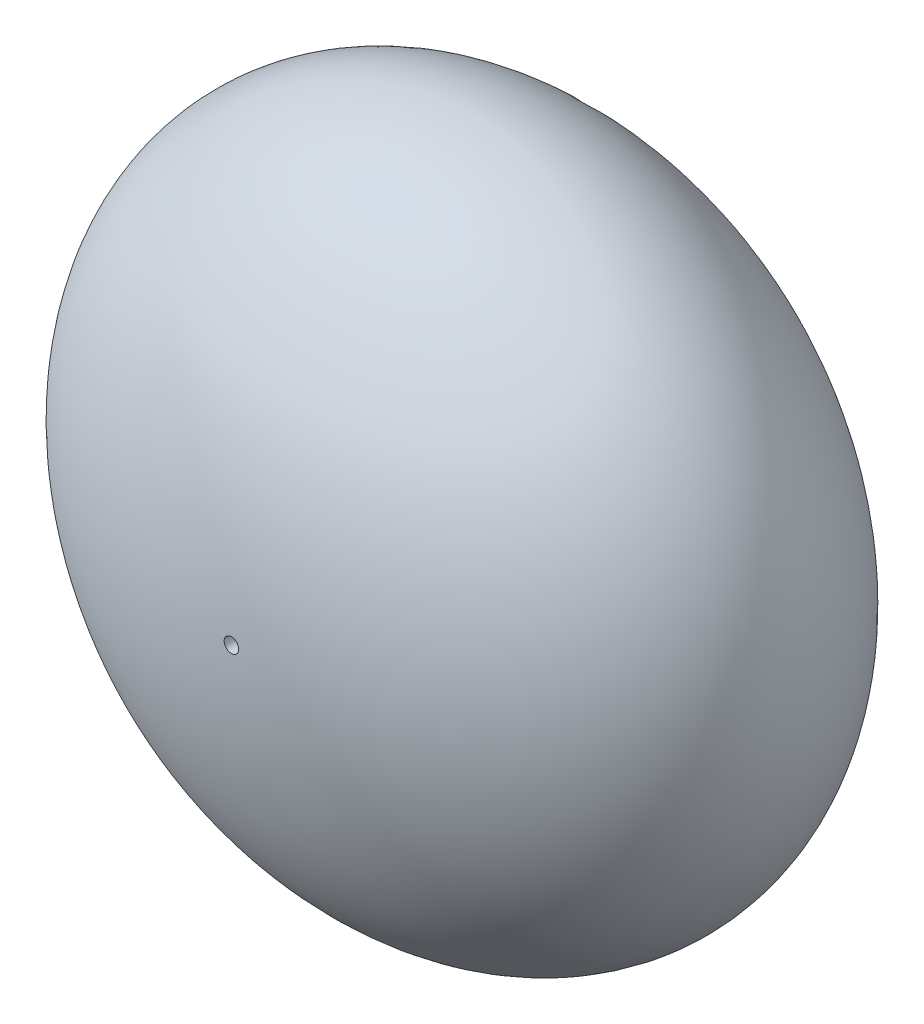
ISO-10303-21;
HEADER;
FILE_DESCRIPTION(('STEP AP214'),'2;1');
FILE_NAME('part.step','',(''),(''),'','','');
FILE_SCHEMA(('AUTOMOTIVE_DESIGN { 1 0 10303 214 1 1 1 1 }'));
ENDSEC;
DATA;
#1=APPLICATION_CONTEXT('core data for automotive mechanical design processes');
#2=APPLICATION_PROTOCOL_DEFINITION('international standard','automotive_design',2000,#1);
#3=PRODUCT_CONTEXT('',#1,'mechanical');
#4=PRODUCT('Part','Part','',(#3));
#5=PRODUCT_RELATED_PRODUCT_CATEGORY('part','',(#4));
#6=PRODUCT_DEFINITION_FORMATION('','',#4);
#7=PRODUCT_DEFINITION_CONTEXT('part definition',#1,'design');
#8=PRODUCT_DEFINITION('design','',#6,#7);
#9=PRODUCT_DEFINITION_SHAPE('','',#8);
#10=(LENGTH_UNIT() NAMED_UNIT(*) SI_UNIT(.MILLI.,.METRE.));
#11=(NAMED_UNIT(*) PLANE_ANGLE_UNIT() SI_UNIT($,.RADIAN.));
#12=(NAMED_UNIT(*) SI_UNIT($,.STERADIAN.) SOLID_ANGLE_UNIT());
#13=UNCERTAINTY_MEASURE_WITH_UNIT(LENGTH_MEASURE(1.E-05),#10,'distance_accuracy_value','');
#14=(GEOMETRIC_REPRESENTATION_CONTEXT(3) GLOBAL_UNCERTAINTY_ASSIGNED_CONTEXT((#13)) GLOBAL_UNIT_ASSIGNED_CONTEXT((#10,
#11,#12)) REPRESENTATION_CONTEXT('',''));
#15=CARTESIAN_POINT('',(0.,0.,0.));
#16=DIRECTION('',(0.,0.,1.));
#17=DIRECTION('',(1.,0.,0.));
#18=AXIS2_PLACEMENT_3D('',#15,#16,#17);
#19=CARTESIAN_POINT('',(0.,0.,-17.5));
#20=DIRECTION('',(0.,0.,1.));
#21=DIRECTION('',(1.,0.,0.));
#22=AXIS2_PLACEMENT_3D('',#19,#20,#21);
#23=CYLINDRICAL_SURFACE('',#22,0.55);
#24=CARTESIAN_POINT('',(0.55,0.,-11.177921898939));
#25=CARTESIAN_POINT('',(0.549996584354101,0.0292890880464978,-11.1779252434519));
#26=CARTESIAN_POINT('',(0.54764557992176,0.0586240745401949,-11.1790302905555));
#27=CARTESIAN_POINT('',(0.538333684049462,0.116444651901983,-11.1833094454078));
#28=CARTESIAN_POINT('',(0.531360454530933,0.14492775559188,-11.1864890905117));
#29=CARTESIAN_POINT('',(0.513127064567445,0.200102445264119,-11.1944867242729));
#30=CARTESIAN_POINT('',(0.501884747890616,0.226800951473643,-11.1992978847494));
#31=CARTESIAN_POINT('',(0.475484784760556,0.277925505448982,-11.2100067448396));
#32=CARTESIAN_POINT('',(0.460327980017856,0.302352040210257,-11.215904210793));
#33=CARTESIAN_POINT('',(0.425489163476123,0.349821819217232,-11.2285443996601));
#34=CARTESIAN_POINT('',(0.405595037885859,0.372701684993177,-11.2353163453649));
#35=CARTESIAN_POINT('',(0.362291415131879,0.414921572384582,-11.2487026551725));
#36=CARTESIAN_POINT('',(0.338880544397149,0.434260204286108,-11.2553169565278));
#37=CARTESIAN_POINT('',(0.287915869395404,0.469691154857652,-11.2679998070127));
#38=CARTESIAN_POINT('',(0.260223115099164,0.485598412218806,-11.2740304453197));
#39=CARTESIAN_POINT('',(0.202253279205904,0.512457490945118,-11.2845073376012));
#40=CARTESIAN_POINT('',(0.171977386097639,0.523411576779545,-11.2889543153887));
#41=CARTESIAN_POINT('',(0.111417228742464,0.53945739634447,-11.2955553658956));
#42=CARTESIAN_POINT('',(0.0812199224342666,0.544831200052888,-11.2978192983373));
#43=CARTESIAN_POINT('',(0.020273076524319,0.550476597756748,-11.3001990180682));
#44=CARTESIAN_POINT('',(-0.0104762263121764,0.550750329323415,-11.3003157053228));
#45=CARTESIAN_POINT('',(-0.0695984560905614,0.546332903137321,-11.2984516009316));
#46=CARTESIAN_POINT('',(-0.0979994824287844,0.541952017620544,-11.2966018835161));
#47=CARTESIAN_POINT('',(-0.153619039878556,0.5288832261357,-11.2911941129559));
#48=CARTESIAN_POINT('',(-0.180837483530745,0.520195002200835,-11.2876359336934));
#49=CARTESIAN_POINT('',(-0.233820832834373,0.498656645870309,-11.2790854512892));
#50=CARTESIAN_POINT('',(-0.259557148757144,0.48574490583588,-11.2740720511414));
#51=CARTESIAN_POINT('',(-0.308565411113046,0.456187553243323,-11.2630989635277));
#52=CARTESIAN_POINT('',(-0.331836474004553,0.439540608615719,-11.2571389386933));
#53=CARTESIAN_POINT('',(-0.377043406996226,0.401585748001151,-11.2443590174114));
#54=CARTESIAN_POINT('',(-0.398760832763222,0.380027735064598,-11.2375081071535));
#55=CARTESIAN_POINT('',(-0.438368395045668,0.333565045382268,-11.2240391008266));
#56=CARTESIAN_POINT('',(-0.456256961893147,0.308659002873907,-11.2174211011665));
#57=CARTESIAN_POINT('',(-0.488284619318832,0.255116036708731,-11.2049417129157));
#58=CARTESIAN_POINT('',(-0.502271701865277,0.226379495620266,-11.1991146355407));
#59=CARTESIAN_POINT('',(-0.525118260627799,0.166647052477239,-11.1892885685234));
#60=CARTESIAN_POINT('',(-0.533981535407572,0.1356528434023,-11.185288225085));
#61=CARTESIAN_POINT('',(-0.54576394234899,0.0744763045543522,-11.1799072944525));
#62=CARTESIAN_POINT('',(-0.549038154845649,0.0443763493187677,-11.1783706262727));
#63=CARTESIAN_POINT('',(-0.550595148433997,-0.0159756645445513,-11.1776443562661));
#64=CARTESIAN_POINT('',(-0.548879747504865,-0.0462276637650902,-11.1784538995904));
#65=CARTESIAN_POINT('',(-0.540830503798465,-0.103890538612671,-11.1821671773214));
#66=CARTESIAN_POINT('',(-0.534813347651109,-0.131356080444527,-11.1849271710595));
#67=CARTESIAN_POINT('',(-0.518754544627559,-0.184863299988254,-11.1920445782361));
#68=CARTESIAN_POINT('',(-0.508711937488001,-0.210904636273031,-11.1964023728056));
#69=CARTESIAN_POINT('',(-0.484409744819563,-0.262076090821648,-11.2064520888271));
#70=CARTESIAN_POINT('',(-0.469987481429532,-0.28711895464769,-11.2121932963035));
#71=CARTESIAN_POINT('',(-0.437495528973988,-0.334551847659952,-11.2242948702046));
#72=CARTESIAN_POINT('',(-0.419424227205111,-0.356940696928813,-11.2306555097434));
#73=CARTESIAN_POINT('',(-0.378349831041445,-0.400398299140258,-11.2439271761637));
#74=CARTESIAN_POINT('',(-0.355059163319483,-0.421195993712111,-11.2508393303521));
#75=CARTESIAN_POINT('',(-0.305160588170078,-0.458639149779856,-11.2639389659696));
#76=CARTESIAN_POINT('',(-0.278552391319555,-0.475284248620322,-11.270126384081));
#77=CARTESIAN_POINT('',(-0.22254516924064,-0.503950781420576,-11.2811284519294));
#78=CARTESIAN_POINT('',(-0.19313595227656,-0.515954458654376,-11.2859378118077));
#79=CARTESIAN_POINT('',(-0.132459111225027,-0.534753805535516,-11.2935946764136));
#80=CARTESIAN_POINT('',(-0.101192644114628,-0.541552681607886,-11.2964433888914));
#81=CARTESIAN_POINT('',(-0.0401076393742858,-0.549336586273179,-11.2997151702275));
#82=CARTESIAN_POINT('',(-0.0103459693448551,-0.550703430440474,-11.3002974773761));
#83=CARTESIAN_POINT('',(0.0489737753278211,-0.548618129779913,-11.2994155631013));
#84=CARTESIAN_POINT('',(0.0785318866334914,-0.545166876815352,-11.2979517204345));
#85=CARTESIAN_POINT('',(0.135463260804812,-0.53381748166551,-11.2932270000675));
#86=CARTESIAN_POINT('',(0.162876891838657,-0.526090561896401,-11.2900354119795));
#87=CARTESIAN_POINT('',(0.21600609040639,-0.506598978061614,-11.2822102384334));
#88=CARTESIAN_POINT('',(0.241721339583218,-0.494833559537302,-11.277576383551));
#89=CARTESIAN_POINT('',(0.292012861209467,-0.467002939755495,-11.2670511217473));
#90=CARTESIAN_POINT('',(0.31648423274669,-0.450766603879703,-11.2611121277958));
#91=CARTESIAN_POINT('',(0.362460491360178,-0.414700935735991,-11.2486755250582));
#92=CARTESIAN_POINT('',(0.383964231440921,-0.394870221045823,-11.2421777018496));
#93=CARTESIAN_POINT('',(0.424973349371498,-0.350531816418174,-11.2287780194831));
#94=CARTESIAN_POINT('',(0.444230913820389,-0.325792944680935,-11.2218799766774));
#95=CARTESIAN_POINT('',(0.478361492723613,-0.273225628506289,-11.20892714366));
#96=CARTESIAN_POINT('',(0.493232006013242,-0.245395434027496,-11.2028728355156));
#97=CARTESIAN_POINT('',(0.518032240823997,-0.187437828597399,-11.1924026431488));
#98=CARTESIAN_POINT('',(0.527979232708572,-0.157318881173992,-11.1879810458919));
#99=CARTESIAN_POINT('',(0.542539705327344,-0.0956420665439862,-11.1814047782879));
#100=CARTESIAN_POINT('',(0.547171075393702,-0.064089399399714,-11.179242506563));
#101=CARTESIAN_POINT('',(0.549682841821689,-0.0216100774158191,-11.1780694531136));
#102=CARTESIAN_POINT('',(0.550001260430514,-0.0108081637806635,-11.1779206647577));
#103=CARTESIAN_POINT('',(0.55,0.,-11.177921898939));
#104=B_SPLINE_CURVE_WITH_KNOTS('',3,(#24,#25,#26,#27,#28,#29,#30,#31,#32,#33,#34,#35,#36,#37,
#38,#39,#40,#41,#42,#43,#44,#45,#46,#47,#48,#49,#50,#51,#52,#53,#54,#55,#56,#57,#58,#59,#60,#61,
#62,#63,#64,#65,#66,#67,#68,#69,#70,#71,#72,#73,#74,#75,#76,#77,#78,#79,#80,#81,#82,#83,#84,#85,
#86,#87,#88,#89,#90,#91,#92,#93,#94,#95,#96,#97,#98,#99,#100,#101,#102,#103),.UNSPECIFIED.,.T.,
.F.,(4,2,2,2,2,2,2,2,2,2,2,2,2,2,2,2,2,2,2,2,2,2,2,2,2,2,2,2,2,2,2,2,2,2,2,2,2,2,2,4),(0.,
0.0878355371372129,0.17590648244113,0.263613293329515,0.351301260790432,0.444095414904151,
0.536925907269127,0.633930355098318,0.730890409908878,0.822667494821197,0.914406112734333,
1.00039179283427,1.08638382132403,1.17369073915177,1.26102884248652,1.35468641907521,
1.44838231802394,1.5453362543049,1.64221822075762,1.73267805275729,1.82310492960093,
1.90748158799703,1.99187838626791,2.07990214726546,2.16796489610847,2.26346287619229,
2.35896919340998,2.45483735780418,2.55064641484856,2.63958764575948,2.72851241521267,
2.81410986203591,2.89972330859476,2.98922824005734,3.07876766904709,3.17462051593961,
3.27052790573209,3.36609645151931,3.4613424165448,3.49375520009185),.UNSPECIFIED.);
#105=CARTESIAN_POINT('',(0.55,0.,-11.177921898939));
#106=VERTEX_POINT('',#105);
#107=EDGE_CURVE('E67',#106,#106,#104,.T.);
#108=ORIENTED_EDGE('',*,*,#107,.T.);
#109=EDGE_LOOP('',(#108));
#110=FACE_BOUND('',#109,.T.);
#111=CARTESIAN_POINT('',(0.,0.,-17.4961583084846));
#112=DIRECTION('',(0.,0.,-1.));
#113=DIRECTION('',(-1.,0.,0.));
#114=AXIS2_PLACEMENT_3D('',#111,#112,#113);
#115=CIRCLE('',#114,0.549999999999996);
#116=CARTESIAN_POINT('',(-0.549999999999993,0.,-17.4961583084846));
#117=VERTEX_POINT('',#116);
#118=EDGE_CURVE('E97',#117,#117,#115,.F.);
#119=ORIENTED_EDGE('',*,*,#118,.F.);
#120=EDGE_LOOP('',(#119));
#121=FACE_BOUND('',#120,.T.);
#122=ADVANCED_FACE('F39',(#110,#121),#23,.F.);
#123=CARTESIAN_POINT('',(0.,0.,13.));
#124=DIRECTION('',(0.,0.,-1.));
#125=DIRECTION('',(-1.,0.,0.));
#126=AXIS2_PLACEMENT_3D('',#123,#124,#125);
#127=CYLINDRICAL_SURFACE('',#126,7.);
#128=CARTESIAN_POINT('',(0.,0.,13.));
#129=DIRECTION('',(0.,0.,1.));
#130=DIRECTION('',(1.,0.,0.));
#131=AXIS2_PLACEMENT_3D('',#128,#129,#130);
#132=CIRCLE('',#131,7.);
#133=CARTESIAN_POINT('',(7.,0.,13.));
#134=VERTEX_POINT('',#133);
#135=EDGE_CURVE('E10',#134,#134,#132,.T.);
#136=ORIENTED_EDGE('',*,*,#135,.T.);
#137=EDGE_LOOP('',(#136));
#138=FACE_BOUND('',#137,.T.);
#139=CARTESIAN_POINT('',(0.,0.,0.));
#140=DIRECTION('',(0.,0.,1.));
#141=DIRECTION('',(1.,0.,0.));
#142=AXIS2_PLACEMENT_3D('',#139,#140,#141);
#143=CIRCLE('',#142,7.);
#144=CARTESIAN_POINT('',(7.,0.,0.));
#145=VERTEX_POINT('',#144);
#146=EDGE_CURVE('E53',#145,#145,#143,.T.);
#147=ORIENTED_EDGE('',*,*,#146,.F.);
#148=EDGE_LOOP('',(#147));
#149=FACE_BOUND('',#148,.T.);
#150=ADVANCED_FACE('F117',(#138,#149),#127,.F.);
#151=CARTESIAN_POINT('',(0.,0.,13.));
#152=DIRECTION('',(0.,0.,1.));
#153=DIRECTION('',(1.,0.,0.));
#154=AXIS2_PLACEMENT_3D('',#151,#152,#153);
#155=PLANE('',#154);
#156=CARTESIAN_POINT('',(0.,0.,13.));
#157=DIRECTION('',(0.,0.,1.));
#158=DIRECTION('',(1.,0.,0.));
#159=AXIS2_PLACEMENT_3D('',#156,#157,#158);
#160=CIRCLE('',#159,0.55);
#161=CARTESIAN_POINT('',(0.55,0.,13.));
#162=VERTEX_POINT('',#161);
#163=EDGE_CURVE('E66',#162,#162,#160,.T.);
#164=ORIENTED_EDGE('',*,*,#163,.T.);
#165=EDGE_LOOP('',(#164));
#166=FACE_BOUND('',#165,.T.);
#167=ORIENTED_EDGE('',*,*,#135,.F.);
#168=EDGE_LOOP('',(#167));
#169=FACE_BOUND('',#168,.T.);
#170=ADVANCED_FACE('F122',(#166,#169),#155,.F.);
#171=CARTESIAN_POINT('',(0.,0.,0.));
#172=DIRECTION('',(0.,0.,1.));
#173=DIRECTION('',(1.,0.,0.));
#174=AXIS2_PLACEMENT_3D('',#171,#172,#173);
#175=PLANE('',#174);
#176=CARTESIAN_POINT('',(0.,0.,0.));
#177=DIRECTION('',(0.,0.,1.));
#178=DIRECTION('',(1.,0.,0.));
#179=AXIS2_PLACEMENT_3D('',#176,#177,#178);
#180=CIRCLE('',#179,0.55);
#181=CARTESIAN_POINT('',(0.55,0.,0.));
#182=VERTEX_POINT('',#181);
#183=EDGE_CURVE('E64',#182,#182,#180,.T.);
#184=ORIENTED_EDGE('',*,*,#183,.F.);
#185=EDGE_LOOP('',(#184));
#186=FACE_BOUND('',#185,.T.);
#187=ORIENTED_EDGE('',*,*,#146,.T.);
#188=EDGE_LOOP('',(#187));
#189=FACE_BOUND('',#188,.T.);
#190=ADVANCED_FACE('F113',(#186,#189),#175,.T.);
#191=CARTESIAN_POINT('',(0.55,0.,-8.82207810106102));
#192=CARTESIAN_POINT('',(0.549996584354101,-0.0292890880464978,-8.82207475654814));
#193=CARTESIAN_POINT('',(0.54764557992176,-0.0586240745401949,-8.82096970944448));
#194=CARTESIAN_POINT('',(0.538333684049462,-0.116444651901983,-8.81669055459222));
#195=CARTESIAN_POINT('',(0.531360454530933,-0.14492775559188,-8.8135109094883));
#196=CARTESIAN_POINT('',(0.513127064567445,-0.200102445264119,-8.80551327572708));
#197=CARTESIAN_POINT('',(0.501884747890616,-0.226800951473643,-8.80070211525059));
#198=CARTESIAN_POINT('',(0.475484784760556,-0.277925505448982,-8.78999325516041));
#199=CARTESIAN_POINT('',(0.460327980017856,-0.302352040210257,-8.78409578920702));
#200=CARTESIAN_POINT('',(0.425489163476123,-0.349821819217232,-8.77145560033992));
#201=CARTESIAN_POINT('',(0.405595037885859,-0.372701684993177,-8.76468365463512));
#202=CARTESIAN_POINT('',(0.362291415131879,-0.414921572384582,-8.7512973448275));
#203=CARTESIAN_POINT('',(0.338880544397149,-0.434260204286108,-8.74468304347223));
#204=CARTESIAN_POINT('',(0.287915869395404,-0.469691154857652,-8.73200019298733));
#205=CARTESIAN_POINT('',(0.260223115099163,-0.485598412218806,-8.72596955468028));
#206=CARTESIAN_POINT('',(0.202253279205904,-0.512457490945118,-8.71549266239879));
#207=CARTESIAN_POINT('',(0.171977386097639,-0.523411576779545,-8.71104568461129));
#208=CARTESIAN_POINT('',(0.111417228742464,-0.53945739634447,-8.70444463410439));
#209=CARTESIAN_POINT('',(0.0812199224342664,-0.544831200052888,-8.70218070166274));
#210=CARTESIAN_POINT('',(0.0202730765243188,-0.550476597756748,-8.69980098193184));
#211=CARTESIAN_POINT('',(-0.0104762263121765,-0.550750329323415,-8.69968429467724));
#212=CARTESIAN_POINT('',(-0.0695984560905615,-0.546332903137321,-8.70154839906841));
#213=CARTESIAN_POINT('',(-0.0979994824287846,-0.541952017620544,-8.70339811648387));
#214=CARTESIAN_POINT('',(-0.153619039878556,-0.5288832261357,-8.70880588704414));
#215=CARTESIAN_POINT('',(-0.180837483530745,-0.520195002200835,-8.71236406630663));
#216=CARTESIAN_POINT('',(-0.233820832834373,-0.498656645870309,-8.72091454871082));
#217=CARTESIAN_POINT('',(-0.259557148757144,-0.48574490583588,-8.72592794885858));
#218=CARTESIAN_POINT('',(-0.308565411113046,-0.456187553243323,-8.73690103647228));
#219=CARTESIAN_POINT('',(-0.331836474004553,-0.439540608615719,-8.74286106130673));
#220=CARTESIAN_POINT('',(-0.377043406996226,-0.401585748001151,-8.7556409825886));
#221=CARTESIAN_POINT('',(-0.398760832763223,-0.380027735064598,-8.76249189284654));
#222=CARTESIAN_POINT('',(-0.438368395045668,-0.333565045382267,-8.77596089917338));
#223=CARTESIAN_POINT('',(-0.456256961893147,-0.308659002873907,-8.78257889883349));
#224=CARTESIAN_POINT('',(-0.488284619318832,-0.255116036708731,-8.79505828708434));
#225=CARTESIAN_POINT('',(-0.502271701865277,-0.226379495620266,-8.80088536445926));
#226=CARTESIAN_POINT('',(-0.525118260627799,-0.166647052477239,-8.81071143147657));
#227=CARTESIAN_POINT('',(-0.533981535407572,-0.1356528434023,-8.814711774915));
#228=CARTESIAN_POINT('',(-0.54576394234899,-0.0744763045543522,-8.8200927055475));
#229=CARTESIAN_POINT('',(-0.549038154845649,-0.0443763493187677,-8.82162937372734));
#230=CARTESIAN_POINT('',(-0.550595148433997,0.0159756645445513,-8.82235564373394));
#231=CARTESIAN_POINT('',(-0.548879747504865,0.0462276637650902,-8.82154610040963));
#232=CARTESIAN_POINT('',(-0.540830503798465,0.103890538612671,-8.81783282267864));
#233=CARTESIAN_POINT('',(-0.534813347651109,0.131356080444527,-8.81507282894051));
#234=CARTESIAN_POINT('',(-0.518754544627559,0.184863299988254,-8.80795542176391));
#235=CARTESIAN_POINT('',(-0.508711937488001,0.210904636273031,-8.80359762719437));
#236=CARTESIAN_POINT('',(-0.484409744819563,0.262076090821648,-8.79354791117293));
#237=CARTESIAN_POINT('',(-0.469987481429532,0.28711895464769,-8.78780670369653));
#238=CARTESIAN_POINT('',(-0.437495528973988,0.334551847659952,-8.77570512979543));
#239=CARTESIAN_POINT('',(-0.419424227205111,0.356940696928813,-8.76934449025662));
#240=CARTESIAN_POINT('',(-0.378349831041445,0.400398299140258,-8.75607282383634));
#241=CARTESIAN_POINT('',(-0.355059163319482,0.421195993712112,-8.74916066964795));
#242=CARTESIAN_POINT('',(-0.305160588170077,0.458639149779856,-8.73606103403038));
#243=CARTESIAN_POINT('',(-0.278552391319555,0.475284248620322,-8.72987361591903));
#244=CARTESIAN_POINT('',(-0.22254516924064,0.503950781420576,-8.71887154807057));
#245=CARTESIAN_POINT('',(-0.193135952276559,0.515954458654376,-8.71406218819228));
#246=CARTESIAN_POINT('',(-0.132459111225027,0.534753805535516,-8.7064053235864));
#247=CARTESIAN_POINT('',(-0.101192644114628,0.541552681607886,-8.70355661110862));
#248=CARTESIAN_POINT('',(-0.0401076393742858,0.549336586273179,-8.70028482977254));
#249=CARTESIAN_POINT('',(-0.0103459693448551,0.550703430440474,-8.69970252262394));
#250=CARTESIAN_POINT('',(0.0489737753278211,0.548618129779913,-8.70058443689867));
#251=CARTESIAN_POINT('',(0.0785318866334914,0.545166876815352,-8.70204827956549));
#252=CARTESIAN_POINT('',(0.135463260804812,0.53381748166551,-8.70677299993251));
#253=CARTESIAN_POINT('',(0.162876891838657,0.526090561896401,-8.70996458802049));
#254=CARTESIAN_POINT('',(0.21600609040639,0.506598978061614,-8.71778976156659));
#255=CARTESIAN_POINT('',(0.241721339583218,0.494833559537302,-8.722423616449));
#256=CARTESIAN_POINT('',(0.292012861209467,0.467002939755495,-8.73294887825268));
#257=CARTESIAN_POINT('',(0.31648423274669,0.450766603879703,-8.73888787220417));
#258=CARTESIAN_POINT('',(0.362460491360178,0.414700935735991,-8.75132447494184));
#259=CARTESIAN_POINT('',(0.383964231440921,0.394870221045823,-8.75782229815042));
#260=CARTESIAN_POINT('',(0.424973349371498,0.350531816418174,-8.77122198051689));
#261=CARTESIAN_POINT('',(0.444230913820389,0.325792944680935,-8.77812002332256));
#262=CARTESIAN_POINT('',(0.478361492723613,0.273225628506289,-8.79107285634003));
#263=CARTESIAN_POINT('',(0.493232006013242,0.245395434027496,-8.79712716448442));
#264=CARTESIAN_POINT('',(0.518032240823997,0.187437828597399,-8.80759735685122));
#265=CARTESIAN_POINT('',(0.527979232708572,0.157318881173992,-8.81201895410813));
#266=CARTESIAN_POINT('',(0.542539705327344,0.0956420665439864,-8.81859522171214));
#267=CARTESIAN_POINT('',(0.547171075393702,0.0640893993997141,-8.82075749343703));
#268=CARTESIAN_POINT('',(0.549682841821689,0.0216100774158191,-8.82193054688639));
#269=CARTESIAN_POINT('',(0.550001260430514,0.0108081637806635,-8.82207933524227));
#270=CARTESIAN_POINT('',(0.55,0.,-8.82207810106102));
#271=B_SPLINE_CURVE_WITH_KNOTS('',3,(#191,#192,#193,#194,#195,#196,#197,#198,#199,#200,#201,
#202,#203,#204,#205,#206,#207,#208,#209,#210,#211,#212,#213,#214,#215,#216,#217,#218,#219,#220,
#221,#222,#223,#224,#225,#226,#227,#228,#229,#230,#231,#232,#233,#234,#235,#236,#237,#238,#239,
#240,#241,#242,#243,#244,#245,#246,#247,#248,#249,#250,#251,#252,#253,#254,#255,#256,#257,#258,
#259,#260,#261,#262,#263,#264,#265,#266,#267,#268,#269,#270),.UNSPECIFIED.,.T.,.F.,(4,2,2,2,2,2,
2,2,2,2,2,2,2,2,2,2,2,2,2,2,2,2,2,2,2,2,2,2,2,2,2,2,2,2,2,2,2,2,2,4),(0.,0.0878355371372129,
0.17590648244113,0.263613293329515,0.351301260790432,0.444095414904151,0.536925907269127,
0.633930355098318,0.730890409908877,0.822667494821197,0.914406112734333,1.00039179283427,
1.08638382132403,1.17369073915177,1.26102884248652,1.35468641907521,1.44838231802394,
1.5453362543049,1.64221822075762,1.73267805275729,1.82310492960093,1.90748158799703,
1.99187838626791,2.07990214726546,2.16796489610847,2.26346287619229,2.35896919340998,
2.45483735780418,2.55064641484856,2.63958764575948,2.72851241521267,2.81410986203591,
2.89972330859476,2.98922824005734,3.07876766904709,3.17462051593961,3.27052790573209,
3.3660964515193,3.4613424165448,3.49375520009185),.UNSPECIFIED.);
#272=CARTESIAN_POINT('',(0.55,0.,-8.82207810106102));
#273=VERTEX_POINT('',#272);
#274=EDGE_CURVE('E86',#273,#273,#271,.T.);
#275=ORIENTED_EDGE('',*,*,#274,.T.);
#276=EDGE_LOOP('',(#275));
#277=FACE_BOUND('',#276,.T.);
#278=ORIENTED_EDGE('',*,*,#183,.T.);
#279=EDGE_LOOP('',(#278));
#280=FACE_BOUND('',#279,.T.);
#281=ADVANCED_FACE('F106',(#277,#280),#23,.F.);
#282=ORIENTED_EDGE('',*,*,#163,.F.);
#283=EDGE_LOOP('',(#282));
#284=FACE_BOUND('',#283,.T.);
#285=CARTESIAN_POINT('',(0.,0.,17.4961583084846));
#286=DIRECTION('',(0.,0.,-1.));
#287=DIRECTION('',(-1.,0.,0.));
#288=AXIS2_PLACEMENT_3D('',#285,#286,#287);
#289=CIRCLE('',#288,0.550000000000004);
#290=CARTESIAN_POINT('',(-0.550000000000007,0.,17.4961583084846));
#291=VERTEX_POINT('',#290);
#292=EDGE_CURVE('E58',#291,#291,#289,.T.);
#293=ORIENTED_EDGE('',*,*,#292,.F.);
#294=EDGE_LOOP('',(#293));
#295=FACE_BOUND('',#294,.T.);
#296=ADVANCED_FACE('F78',(#284,#295),#23,.F.);
#297=CARTESIAN_POINT('',(0.,0.,0.));
#298=DIRECTION('',(0.,1.,0.));
#299=DIRECTION('',(-1.,0.,0.));
#300=AXIS2_PLACEMENT_3D('',#297,#298,#299);
#301=ELLIPSE('',#300,26.25,17.5);
#302=TRIMMED_CURVE('',#301,(PARAMETER_VALUE(1.5707963267949)),
(PARAMETER_VALUE(4.71238898038469)),.T.,.PARAMETER.);
#303=CARTESIAN_POINT('',(0.,0.,-17.5));
#304=DIRECTION('',(0.,0.,-1.));
#305=AXIS1_PLACEMENT('',#303,#304);
#306=SURFACE_OF_REVOLUTION('',#302,#305);
#307=CARTESIAN_POINT('',(0.,-22.7763034753228,-8.7));
#308=CARTESIAN_POINT('',(0.05903579907806,-22.7763001944973,-8.70000382827941));
#309=CARTESIAN_POINT('',(0.118173687376762,-22.7725860234372,-8.7040585617018));
#310=CARTESIAN_POINT('',(0.234551062418281,-22.7579772005303,-8.71997844725941));
#311=CARTESIAN_POINT('',(0.291785279244687,-22.747064117999,-8.73186364689128));
#312=CARTESIAN_POINT('',(0.402298324864022,-22.7188580898483,-8.76249310643379));
#313=CARTESIAN_POINT('',(0.455599515171826,-22.7016051955612,-8.78119430083926));
#314=CARTESIAN_POINT('',(0.557569931446794,-22.6616559407577,-8.82433547124609));
#315=CARTESIAN_POINT('',(0.606239181797162,-22.6389596088985,-8.84877541703548));
#316=CARTESIAN_POINT('',(0.714833704469163,-22.5801902371065,-8.91177750480023));
#317=CARTESIAN_POINT('',(0.772616006443994,-22.5422293965367,-8.95227224434743));
#318=CARTESIAN_POINT('',(0.878448250112258,-22.4601105870634,-9.0392490053572));
#319=CARTESIAN_POINT('',(0.926478963534867,-22.415940659608,-9.08574256586394));
#320=CARTESIAN_POINT('',(1.02865068577204,-22.3063558901004,-9.20019410770601));
#321=CARTESIAN_POINT('',(1.07879154179613,-22.2390080807459,-9.26986420809626));
#322=CARTESIAN_POINT('',(1.16301330472815,-22.0988542018509,-9.41320334302579));
#323=CARTESIAN_POINT('',(1.19707066285992,-22.0260403086369,-9.48687806618165));
#324=CARTESIAN_POINT('',(1.25899623581459,-21.8532351801029,-9.65967678450414));
#325=CARTESIAN_POINT('',(1.2814634245029,-21.7519571385863,-9.75945191936713));
#326=CARTESIAN_POINT('',(1.30320672849965,-21.5465840275931,-9.95862566842676));
#327=CARTESIAN_POINT('',(1.30245126100238,-21.4424853141304,-10.0580235859725));
#328=CARTESIAN_POINT('',(1.27859210454065,-21.232584768052,-10.2553722418605));
#329=CARTESIAN_POINT('',(1.25517889847206,-21.1267793230723,-10.3532838438307));
#330=CARTESIAN_POINT('',(1.2027490798305,-20.9703014248552,-10.49593586096));
#331=CARTESIAN_POINT('',(1.18239347158339,-20.9185243169451,-10.5427747157362));
#332=CARTESIAN_POINT('',(1.1356943716892,-20.8161536759178,-10.6347093610355));
#333=CARTESIAN_POINT('',(1.1093536800758,-20.7655596015046,-10.6798059551432));
#334=CARTESIAN_POINT('',(1.04157755412305,-20.6513100738193,-10.7809290505389));
#335=CARTESIAN_POINT('',(0.997982918033586,-20.5882516567978,-10.8362112922464));
#336=CARTESIAN_POINT('',(0.89923351997688,-20.4670447738788,-10.9415878503589));
#337=CARTESIAN_POINT('',(0.844096418555729,-20.4088889952131,-10.9916899197206));
#338=CARTESIAN_POINT('',(0.73807880193659,-20.3154583232977,-11.0716042658193));
#339=CARTESIAN_POINT('',(0.690238616382713,-20.278303684783,-11.1031957112215));
#340=CARTESIAN_POINT('',(0.61333643045182,-20.2270334126426,-11.1465960673524));
#341=CARTESIAN_POINT('',(0.586863721678155,-20.2106958485411,-11.1603909279459));
#342=CARTESIAN_POINT('',(0.532168512479892,-20.1797436607411,-11.1864722684343));
#343=CARTESIAN_POINT('',(0.503943929978771,-20.1651311494712,-11.1987568997105));
#344=CARTESIAN_POINT('',(0.430034464379367,-20.1305746906582,-11.2277567910141));
#345=CARTESIAN_POINT('',(0.383183715194574,-20.1120387332761,-11.243260442429));
#346=CARTESIAN_POINT('',(0.286194063702813,-20.0810953825387,-11.2690957049013));
#347=CARTESIAN_POINT('',(0.236060789714376,-20.0686777948333,-11.2794359196015));
#348=CARTESIAN_POINT('',(0.133266691052902,-20.0509352443923,-11.2941991144414));
#349=CARTESIAN_POINT('',(0.080589721974579,-20.045664206698,-11.298577107102));
#350=CARTESIAN_POINT('',(-0.0251019192802132,-20.0429519236505,-11.3008307303497));
#351=CARTESIAN_POINT('',(-0.0781164891248771,-20.0455084087859,-11.2987082456848));
#352=CARTESIAN_POINT('',(-0.176916473082029,-20.0574738703272,-11.2887593038656));
#353=CARTESIAN_POINT('',(-0.222865534678109,-20.0661151778573,-11.2815717856559));
#354=CARTESIAN_POINT('',(-0.312504814931082,-20.0887445613477,-11.2627117270845));
#355=CARTESIAN_POINT('',(-0.356192385588388,-20.1027387511476,-11.2510340581794));
#356=CARTESIAN_POINT('',(-0.427517568223655,-20.1301796094286,-11.2280753756736));
#357=CARTESIAN_POINT('',(-0.455943854806258,-20.1424597047677,-11.2177864358004));
#358=CARTESIAN_POINT('',(-0.511242675933962,-20.1688584043507,-11.1956240590634));
#359=CARTESIAN_POINT('',(-0.538116621715168,-20.1829752995275,-11.1837520948871));
#360=CARTESIAN_POINT('',(-0.616469752090796,-20.2277588622434,-11.1460063878113));
#361=CARTESIAN_POINT('',(-0.665583345749628,-20.2608195270467,-11.1180352496067));
#362=CARTESIAN_POINT('',(-0.778520231040738,-20.3476334156179,-11.0441872001929));
#363=CARTESIAN_POINT('',(-0.838804289257773,-20.4039371134055,-10.9959701715184));
#364=CARTESIAN_POINT('',(-0.947192785403266,-20.5224862764945,-10.8935309457271));
#365=CARTESIAN_POINT('',(-0.995272567425901,-20.5847434256713,-10.8392969051583));
#366=CARTESIAN_POINT('',(-1.06846320732727,-20.6950583307027,-10.7422791864561));
#367=CARTESIAN_POINT('',(-1.09624550586638,-20.7422622720248,-10.7004943530532));
#368=CARTESIAN_POINT('',(-1.14630967238807,-20.8379906005831,-10.6151599604957));
#369=CARTESIAN_POINT('',(-1.16858922522594,-20.8865155340944,-10.5716096675072));
#370=CARTESIAN_POINT('',(-1.22753180012817,-21.0334093995516,-10.4388175889798));
#371=CARTESIAN_POINT('',(-1.25629950231363,-21.1330985911723,-10.3474335558408));
#372=CARTESIAN_POINT('',(-1.29387586892048,-21.335456355485,-10.1591341345689));
#373=CARTESIAN_POINT('',(-1.30218882118307,-21.4381390017633,-10.062138624413));
#374=CARTESIAN_POINT('',(-1.29684155137035,-21.6417146327102,-9.8668603704296));
#375=CARTESIAN_POINT('',(-1.28319899979484,-21.7426089905894,-9.76857872485781));
#376=CARTESIAN_POINT('',(-1.23716728845994,-21.920622272822,-9.59256408946306));
#377=CARTESIAN_POINT('',(-1.20894409190794,-21.9985463123037,-9.51455508826631));
#378=CARTESIAN_POINT('',(-1.13566242342189,-22.1494913068793,-9.36169212507661));
#379=CARTESIAN_POINT('',(-1.09062780117901,-22.2225190358621,-9.28683385987924));
#380=CARTESIAN_POINT('',(-0.996632565377332,-22.3423451398654,-9.16270775503264));
#381=CARTESIAN_POINT('',(-0.951937510379424,-22.3909375511318,-9.11194736563528));
#382=CARTESIAN_POINT('',(-0.852032710029221,-22.4824321894357,-9.01570345497734));
#383=CARTESIAN_POINT('',(-0.796825320404223,-22.5253356876646,-8.97021875514596));
#384=CARTESIAN_POINT('',(-0.68878548617563,-22.5949789071414,-8.89595749817048));
#385=CARTESIAN_POINT('',(-0.637952074727203,-22.6232150048447,-8.86568572626317));
#386=CARTESIAN_POINT('',(-0.530292313663203,-22.6735202174418,-8.81155618329686));
#387=CARTESIAN_POINT('',(-0.473483767328913,-22.6956069755413,-8.78768006994));
#388=CARTESIAN_POINT('',(-0.363170661769333,-22.7298269334471,-8.75059619684237));
#389=CARTESIAN_POINT('',(-0.310307332511145,-22.7429178188153,-8.73636591703857));
#390=CARTESIAN_POINT('',(-0.202148320606587,-22.7628846299309,-8.71463638138862));
#391=CARTESIAN_POINT('',(-0.146859357106539,-22.7697767115874,-8.70711962847194));
#392=CARTESIAN_POINT('',(-0.0760304638155284,-22.7743460368861,-8.70213550402117));
#393=CARTESIAN_POINT('',(-0.0608473202130266,-22.7750791540348,-8.70133576214649));
#394=CARTESIAN_POINT('',(-0.0304450509569386,-22.7760583283121,-8.7002674815816));
#395=CARTESIAN_POINT('',(-0.0152259208408754,-22.7763043214804,-8.69999901264859));
#396=CARTESIAN_POINT('',(0.,-22.7763034753228,-8.7));
#397=B_SPLINE_CURVE_WITH_KNOTS('',3,(#307,#308,#309,#310,#311,#312,#313,#314,#315,#316,#317,
#318,#319,#320,#321,#322,#323,#324,#325,#326,#327,#328,#329,#330,#331,#332,#333,#334,#335,#336,
#337,#338,#339,#340,#341,#342,#343,#344,#345,#346,#347,#348,#349,#350,#351,#352,#353,#354,#355,
#356,#357,#358,#359,#360,#361,#362,#363,#364,#365,#366,#367,#368,#369,#370,#371,#372,#373,#374,
#375,#376,#377,#378,#379,#380,#381,#382,#383,#384,#385,#386,#387,#388,#389,#390,#391,#392,#393,
#394,#395,#396),.UNSPECIFIED.,.T.,.F.,(4,2,2,2,2,2,2,2,2,2,2,2,2,2,2,2,2,2,2,2,2,2,2,2,2,2,2,2,
2,2,2,2,2,2,2,2,2,2,2,2,2,2,2,2,4),(0.,0.177039048020248,0.354533120523432,0.530924640748825,
0.707315232372264,0.946364709668546,1.18588106445525,1.51141334827675,1.8374207961485,
2.26696817054722,2.6970997550645,3.13319134277712,3.35114698414688,3.5690008673437,
3.85172892498678,4.13402751565576,4.33824988571145,4.44023234223633,4.54233841456494,
4.69983451742637,4.85706730731796,5.01548003144663,5.17384682974832,5.31515747780475,
5.45663000928317,5.55439489905232,5.65206946455455,5.84774232261702,6.13286516359972,
6.41855952492477,6.62497431038263,6.83147579240751,7.24447352989521,7.66738563331268,
8.08995753357462,8.43027513829204,8.77011177167626,9.01912889453661,9.26809028025036,
9.46402062554939,9.65938288964953,9.8275446967386,9.99526694378526,10.0409210842806,
10.0865812188599),.UNSPECIFIED.);
#398=CARTESIAN_POINT('',(0.,-22.7763034753228,-8.7));
#399=VERTEX_POINT('',#398);
#400=EDGE_CURVE('E45',#399,#399,#397,.T.);
#401=ORIENTED_EDGE('',*,*,#400,.T.);
#402=EDGE_LOOP('',(#401));
#403=FACE_BOUND('',#402,.T.);
#404=CARTESIAN_POINT('',(0.,22.7763034753228,-8.7));
#405=CARTESIAN_POINT('',(-0.05903579907806,22.7763001944973,-8.70000382827941));
#406=CARTESIAN_POINT('',(-0.118173687376762,22.7725860234372,-8.7040585617018));
#407=CARTESIAN_POINT('',(-0.234551062418281,22.7579772005303,-8.71997844725941));
#408=CARTESIAN_POINT('',(-0.291785279244687,22.747064117999,-8.73186364689128));
#409=CARTESIAN_POINT('',(-0.402298324864022,22.7188580898483,-8.76249310643379));
#410=CARTESIAN_POINT('',(-0.455599515171827,22.7016051955612,-8.78119430083926));
#411=CARTESIAN_POINT('',(-0.557569931446794,22.6616559407577,-8.82433547124609));
#412=CARTESIAN_POINT('',(-0.606239181797162,22.6389596088985,-8.84877541703548));
#413=CARTESIAN_POINT('',(-0.714833704469162,22.5801902371065,-8.91177750480023));
#414=CARTESIAN_POINT('',(-0.772616006443994,22.5422293965367,-8.95227224434743));
#415=CARTESIAN_POINT('',(-0.878448250112255,22.4601105870634,-9.0392490053572));
#416=CARTESIAN_POINT('',(-0.926478963534861,22.415940659608,-9.08574256586394));
#417=CARTESIAN_POINT('',(-1.02865068577204,22.3063558901004,-9.20019410770601));
#418=CARTESIAN_POINT('',(-1.07879154179613,22.2390080807459,-9.26986420809626));
#419=CARTESIAN_POINT('',(-1.16301330472815,22.098854201851,-9.41320334302579));
#420=CARTESIAN_POINT('',(-1.19707066285992,22.0260403086369,-9.48687806618164));
#421=CARTESIAN_POINT('',(-1.25899623581459,21.8532351801029,-9.65967678450413));
#422=CARTESIAN_POINT('',(-1.2814634245029,21.7519571385863,-9.75945191936712));
#423=CARTESIAN_POINT('',(-1.30320672849965,21.5465840275931,-9.95862566842676));
#424=CARTESIAN_POINT('',(-1.30245126100237,21.4424853141304,-10.0580235859725));
#425=CARTESIAN_POINT('',(-1.27859210454065,21.232584768052,-10.2553722418605));
#426=CARTESIAN_POINT('',(-1.25517889847206,21.1267793230723,-10.3532838438307));
#427=CARTESIAN_POINT('',(-1.20274907983051,20.9703014248552,-10.49593586096));
#428=CARTESIAN_POINT('',(-1.18239347158339,20.9185243169451,-10.5427747157362));
#429=CARTESIAN_POINT('',(-1.1356943716892,20.8161536759178,-10.6347093610355));
#430=CARTESIAN_POINT('',(-1.1093536800758,20.7655596015046,-10.6798059551432));
#431=CARTESIAN_POINT('',(-1.04157755412305,20.6513100738193,-10.7809290505389));
#432=CARTESIAN_POINT('',(-0.997982918033589,20.5882516567978,-10.8362112922464));
#433=CARTESIAN_POINT('',(-0.899233519976886,20.4670447738788,-10.9415878503589));
#434=CARTESIAN_POINT('',(-0.844096418555741,20.4088889952131,-10.9916899197206));
#435=CARTESIAN_POINT('',(-0.738078801936601,20.3154583232977,-11.0716042658193));
#436=CARTESIAN_POINT('',(-0.69023861638272,20.278303684783,-11.1031957112215));
#437=CARTESIAN_POINT('',(-0.613336430451828,20.2270334126427,-11.1465960673524));
#438=CARTESIAN_POINT('',(-0.586863721678164,20.2106958485411,-11.1603909279459));
#439=CARTESIAN_POINT('',(-0.532168512479901,20.1797436607411,-11.1864722684343));
#440=CARTESIAN_POINT('',(-0.503943929978778,20.1651311494712,-11.1987568997105));
#441=CARTESIAN_POINT('',(-0.430034464379372,20.1305746906582,-11.2277567910141));
#442=CARTESIAN_POINT('',(-0.383183715194581,20.1120387332761,-11.243260442429));
#443=CARTESIAN_POINT('',(-0.286194063702819,20.0810953825387,-11.2690957049013));
#444=CARTESIAN_POINT('',(-0.236060789714381,20.0686777948333,-11.2794359196015));
#445=CARTESIAN_POINT('',(-0.133266691052904,20.0509352443923,-11.2941991144414));
#446=CARTESIAN_POINT('',(-0.0805897219745792,20.045664206698,-11.298577107102));
#447=CARTESIAN_POINT('',(0.0251019192802165,20.0429519236505,-11.3008307303497));
#448=CARTESIAN_POINT('',(0.0781164891248825,20.0455084087859,-11.2987082456848));
#449=CARTESIAN_POINT('',(0.176916473082034,20.0574738703272,-11.2887593038656));
#450=CARTESIAN_POINT('',(0.222865534678113,20.0661151778573,-11.2815717856559));
#451=CARTESIAN_POINT('',(0.312504814931084,20.0887445613477,-11.2627117270845));
#452=CARTESIAN_POINT('',(0.356192385588389,20.1027387511476,-11.2510340581794));
#453=CARTESIAN_POINT('',(0.427517568223656,20.1301796094286,-11.2280753756736));
#454=CARTESIAN_POINT('',(0.455943854806259,20.1424597047677,-11.2177864358004));
#455=CARTESIAN_POINT('',(0.511242675933964,20.1688584043507,-11.1956240590634));
#456=CARTESIAN_POINT('',(0.538116621715169,20.1829752995275,-11.1837520948871));
#457=CARTESIAN_POINT('',(0.6164697520908,20.2277588622434,-11.1460063878113));
#458=CARTESIAN_POINT('',(0.665583345749634,20.2608195270467,-11.1180352496067));
#459=CARTESIAN_POINT('',(0.778520231040745,20.3476334156179,-11.0441872001929));
#460=CARTESIAN_POINT('',(0.838804289257778,20.4039371134055,-10.9959701715184));
#461=CARTESIAN_POINT('',(0.947192785403265,20.5224862764945,-10.8935309457271));
#462=CARTESIAN_POINT('',(0.995272567425896,20.5847434256713,-10.8392969051583));
#463=CARTESIAN_POINT('',(1.06846320732727,20.6950583307027,-10.7422791864561));
#464=CARTESIAN_POINT('',(1.09624550586638,20.7422622720248,-10.7004943530532));
#465=CARTESIAN_POINT('',(1.14630967238808,20.8379906005831,-10.6151599604956));
#466=CARTESIAN_POINT('',(1.16858922522595,20.8865155340945,-10.5716096675072));
#467=CARTESIAN_POINT('',(1.22753180012817,21.0334093995516,-10.4388175889798));
#468=CARTESIAN_POINT('',(1.25629950231362,21.1330985911723,-10.3474335558407));
#469=CARTESIAN_POINT('',(1.29387586892047,21.335456355485,-10.1591341345689));
#470=CARTESIAN_POINT('',(1.30218882118306,21.4381390017634,-10.062138624413));
#471=CARTESIAN_POINT('',(1.29684155137035,21.6417146327102,-9.86686037042958));
#472=CARTESIAN_POINT('',(1.28319899979485,21.7426089905894,-9.76857872485779));
#473=CARTESIAN_POINT('',(1.23716728845994,21.9206222728221,-9.59256408946304));
#474=CARTESIAN_POINT('',(1.20894409190794,21.9985463123037,-9.5145550882663));
#475=CARTESIAN_POINT('',(1.13566242342188,22.1494913068794,-9.36169212507659));
#476=CARTESIAN_POINT('',(1.090627801179,22.2225190358621,-9.28683385987923));
#477=CARTESIAN_POINT('',(0.996632565377325,22.3423451398654,-9.16270775503262));
#478=CARTESIAN_POINT('',(0.951937510379414,22.3909375511318,-9.11194736563527));
#479=CARTESIAN_POINT('',(0.852032710029212,22.4824321894357,-9.01570345497733));
#480=CARTESIAN_POINT('',(0.796825320404218,22.5253356876646,-8.97021875514596));
#481=CARTESIAN_POINT('',(0.688785486175627,22.5949789071414,-8.89595749817047));
#482=CARTESIAN_POINT('',(0.637952074727199,22.6232150048447,-8.86568572626317));
#483=CARTESIAN_POINT('',(0.530292313663195,22.6735202174418,-8.81155618329686));
#484=CARTESIAN_POINT('',(0.473483767328903,22.6956069755413,-8.78768006994));
#485=CARTESIAN_POINT('',(0.363170661769321,22.7298269334471,-8.75059619684237));
#486=CARTESIAN_POINT('',(0.310307332511134,22.7429178188153,-8.73636591703857));
#487=CARTESIAN_POINT('',(0.202148320606573,22.7628846299309,-8.71463638138862));
#488=CARTESIAN_POINT('',(0.146859357106523,22.7697767115874,-8.70711962847194));
#489=CARTESIAN_POINT('',(0.0760304638155139,22.7743460368861,-8.70213550402117));
#490=CARTESIAN_POINT('',(0.0608473202130151,22.7750791540348,-8.70133576214649));
#491=CARTESIAN_POINT('',(0.030445050956933,22.7760583283121,-8.70026748158159));
#492=CARTESIAN_POINT('',(0.0152259208408725,22.7763043214804,-8.69999901264859));
#493=CARTESIAN_POINT('',(0.,22.7763034753228,-8.7));
#494=B_SPLINE_CURVE_WITH_KNOTS('',3,(#404,#405,#406,#407,#408,#409,#410,#411,#412,#413,#414,
#415,#416,#417,#418,#419,#420,#421,#422,#423,#424,#425,#426,#427,#428,#429,#430,#431,#432,#433,
#434,#435,#436,#437,#438,#439,#440,#441,#442,#443,#444,#445,#446,#447,#448,#449,#450,#451,#452,
#453,#454,#455,#456,#457,#458,#459,#460,#461,#462,#463,#464,#465,#466,#467,#468,#469,#470,#471,
#472,#473,#474,#475,#476,#477,#478,#479,#480,#481,#482,#483,#484,#485,#486,#487,#488,#489,#490,
#491,#492,#493),.UNSPECIFIED.,.T.,.F.,(4,2,2,2,2,2,2,2,2,2,2,2,2,2,2,2,2,2,2,2,2,2,2,2,2,2,2,2,
2,2,2,2,2,2,2,2,2,2,2,2,2,2,2,2,4),(0.,0.177039048020248,0.354533120523433,0.530924640748826,
0.707315232372264,0.946364709668544,1.18588106445525,1.51141334827674,1.83742079614849,
2.26696817054722,2.6970997550645,3.13319134277712,3.35114698414687,3.56900086734369,
3.85172892498677,4.13402751565575,4.33824988571144,4.44023234223632,4.54233841456493,
4.69983451742636,4.85706730731796,5.01548003144663,5.17384682974833,5.31515747780476,
5.45663000928317,5.55439489905233,5.65206946455456,5.84774232261703,6.13286516359973,
6.41855952492478,6.62497431038265,6.83147579240753,7.24447352989523,7.66738563331269,
8.08995753357464,8.43027513829206,8.77011177167628,9.01912889453663,9.26809028025037,
9.46402062554941,9.65938288964955,9.82754469673863,9.99526694378528,10.0409210842806,
10.0865812188599),.UNSPECIFIED.);
#495=CARTESIAN_POINT('',(0.,22.7763034753228,-8.7));
#496=VERTEX_POINT('',#495);
#497=EDGE_CURVE('E68',#496,#496,#494,.T.);
#498=ORIENTED_EDGE('',*,*,#497,.T.);
#499=EDGE_LOOP('',(#498));
#500=FACE_BOUND('',#499,.T.);
#501=ORIENTED_EDGE('',*,*,#292,.T.);
#502=EDGE_LOOP('',(#501));
#503=FACE_BOUND('',#502,.T.);
#504=ORIENTED_EDGE('',*,*,#118,.T.);
#505=EDGE_LOOP('',(#504));
#506=FACE_BOUND('',#505,.T.);
#507=ADVANCED_FACE('F41',(#403,#500,#503,#506),#306,.T.);
#508=CARTESIAN_POINT('',(0.,-26.25,-10.));
#509=DIRECTION('',(0.,1.,0.));
#510=DIRECTION('',(0.,0.,1.));
#511=AXIS2_PLACEMENT_3D('',#508,#509,#510);
#512=CYLINDRICAL_SURFACE('',#511,1.3);
#513=ORIENTED_EDGE('',*,*,#274,.F.);
#514=EDGE_LOOP('',(#513));
#515=FACE_BOUND('',#514,.T.);
#516=ORIENTED_EDGE('',*,*,#497,.F.);
#517=EDGE_LOOP('',(#516));
#518=FACE_BOUND('',#517,.T.);
#519=ORIENTED_EDGE('',*,*,#400,.F.);
#520=EDGE_LOOP('',(#519));
#521=FACE_BOUND('',#520,.T.);
#522=ORIENTED_EDGE('',*,*,#107,.F.);
#523=EDGE_LOOP('',(#522));
#524=FACE_BOUND('',#523,.T.);
#525=ADVANCED_FACE('F73',(#515,#518,#521,#524),#512,.F.);
#526=CLOSED_SHELL('',(#122,#150,#170,#190,#281,#296,#507,#525));
#527=MANIFOLD_SOLID_BREP('B2',#526);
#528=ADVANCED_BREP_SHAPE_REPRESENTATION('',(#18,#527),#14);
#529=SHAPE_DEFINITION_REPRESENTATION(#9,#528);
ENDSEC;
END-ISO-10303-21;
